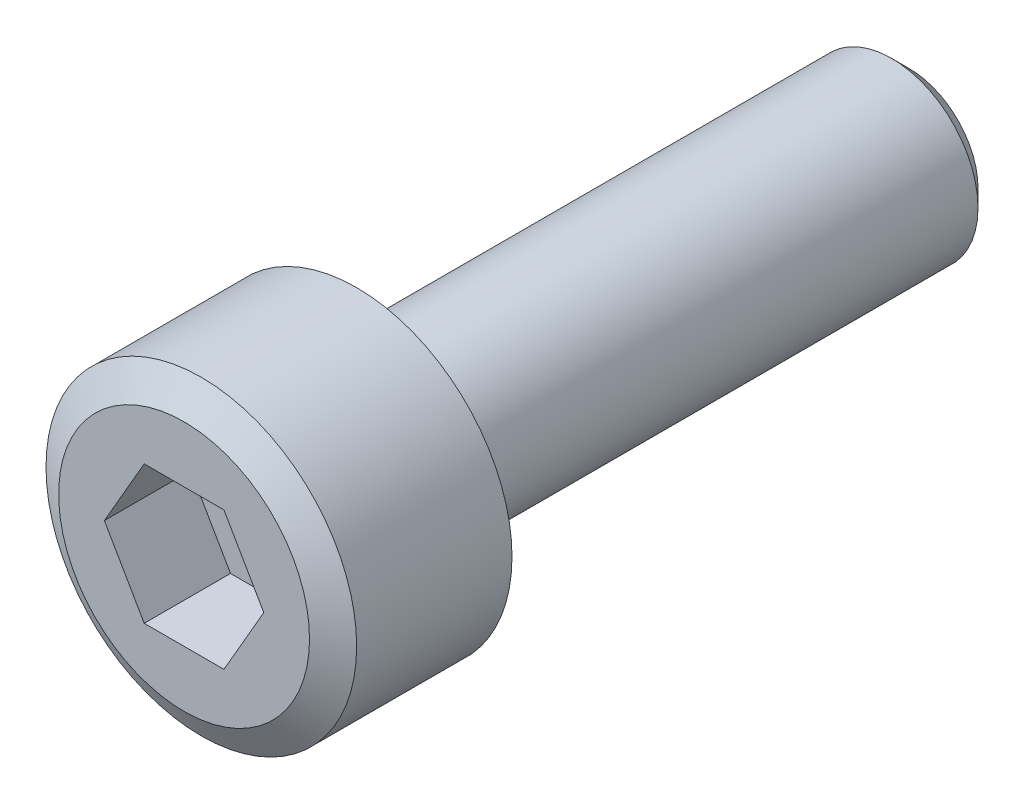
ISO-10303-21;
HEADER;
FILE_DESCRIPTION(('STEP AP214'),'2;1');
FILE_NAME('part.step','',(''),(''),'','','');
FILE_SCHEMA(('AUTOMOTIVE_DESIGN { 1 0 10303 214 1 1 1 1 }'));
ENDSEC;
DATA;
#1=APPLICATION_CONTEXT('core data for automotive mechanical design processes');
#2=APPLICATION_PROTOCOL_DEFINITION('international standard','automotive_design',2000,#1);
#3=PRODUCT_CONTEXT('',#1,'mechanical');
#4=PRODUCT('Part','Part','',(#3));
#5=PRODUCT_RELATED_PRODUCT_CATEGORY('part','',(#4));
#6=PRODUCT_DEFINITION_FORMATION('','',#4);
#7=PRODUCT_DEFINITION_CONTEXT('part definition',#1,'design');
#8=PRODUCT_DEFINITION('design','',#6,#7);
#9=PRODUCT_DEFINITION_SHAPE('','',#8);
#10=(LENGTH_UNIT() NAMED_UNIT(*) SI_UNIT(.MILLI.,.METRE.));
#11=(NAMED_UNIT(*) PLANE_ANGLE_UNIT() SI_UNIT($,.RADIAN.));
#12=(NAMED_UNIT(*) SI_UNIT($,.STERADIAN.) SOLID_ANGLE_UNIT());
#13=UNCERTAINTY_MEASURE_WITH_UNIT(LENGTH_MEASURE(1.E-05),#10,'distance_accuracy_value','');
#14=(GEOMETRIC_REPRESENTATION_CONTEXT(3) GLOBAL_UNCERTAINTY_ASSIGNED_CONTEXT((#13)) GLOBAL_UNIT_ASSIGNED_CONTEXT((#10,
#11,#12)) REPRESENTATION_CONTEXT('',''));
#15=CARTESIAN_POINT('',(0.,0.,0.));
#16=DIRECTION('',(0.,0.,1.));
#17=DIRECTION('',(1.,0.,0.));
#18=AXIS2_PLACEMENT_3D('',#15,#16,#17);
#19=CARTESIAN_POINT('',(0.,1.81698729810778,2.5));
#20=DIRECTION('',(0.,0.,-1.));
#21=DIRECTION('',(-1.,0.,0.));
#22=AXIS2_PLACEMENT_3D('',#19,#20,#21);
#23=PLANE('',#22);
#24=DIRECTION('',(-0.5,0.866025403784439,0.));
#25=VECTOR('',#24,1.);
#26=CARTESIAN_POINT('',(1.15470053837925,0.,2.5));
#27=LINE('',#26,#25);
#28=CARTESIAN_POINT('',(1.15470053837925,0.,2.5));
#29=VERTEX_POINT('',#28);
#30=CARTESIAN_POINT('',(0.577350269189626,1.,2.5));
#31=VERTEX_POINT('',#30);
#32=EDGE_CURVE('E121',#29,#31,#27,.T.);
#33=ORIENTED_EDGE('',*,*,#32,.F.);
#34=DIRECTION('',(0.5,0.866025403784439,0.));
#35=VECTOR('',#34,1.);
#36=CARTESIAN_POINT('',(0.577350269189626,-1.,2.5));
#37=LINE('',#36,#35);
#38=CARTESIAN_POINT('',(0.577350269189626,-1.,2.5));
#39=VERTEX_POINT('',#38);
#40=EDGE_CURVE('E47',#39,#29,#37,.T.);
#41=ORIENTED_EDGE('',*,*,#40,.F.);
#42=DIRECTION('',(1.,0.,0.));
#43=VECTOR('',#42,1.);
#44=CARTESIAN_POINT('',(-0.577350269189626,-1.,2.5));
#45=LINE('',#44,#43);
#46=CARTESIAN_POINT('',(-0.577350269189626,-1.,2.5));
#47=VERTEX_POINT('',#46);
#48=EDGE_CURVE('E130',#47,#39,#45,.T.);
#49=ORIENTED_EDGE('',*,*,#48,.F.);
#50=DIRECTION('',(0.5,-0.866025403784439,0.));
#51=VECTOR('',#50,1.);
#52=CARTESIAN_POINT('',(-1.15470053837925,0.,2.5));
#53=LINE('',#52,#51);
#54=CARTESIAN_POINT('',(-1.15470053837925,0.,2.5));
#55=VERTEX_POINT('',#54);
#56=EDGE_CURVE('E128',#55,#47,#53,.T.);
#57=ORIENTED_EDGE('',*,*,#56,.F.);
#58=DIRECTION('',(-0.5,-0.866025403784439,0.));
#59=VECTOR('',#58,1.);
#60=CARTESIAN_POINT('',(-0.577350269189626,1.,2.5));
#61=LINE('',#60,#59);
#62=CARTESIAN_POINT('',(-0.577350269189626,1.,2.5));
#63=VERTEX_POINT('',#62);
#64=EDGE_CURVE('E95',#63,#55,#61,.T.);
#65=ORIENTED_EDGE('',*,*,#64,.F.);
#66=DIRECTION('',(-1.,0.,0.));
#67=VECTOR('',#66,1.);
#68=CARTESIAN_POINT('',(0.577350269189626,1.,2.5));
#69=LINE('',#68,#67);
#70=EDGE_CURVE('E124',#31,#63,#69,.T.);
#71=ORIENTED_EDGE('',*,*,#70,.F.);
#72=EDGE_LOOP('',(#33,#41,#49,#57,#65,#71));
#73=FACE_BOUND('',#72,.T.);
#74=CARTESIAN_POINT('',(0.,0.,2.5));
#75=DIRECTION('',(0.,0.,1.));
#76=DIRECTION('',(1.,0.,0.));
#77=AXIS2_PLACEMENT_3D('',#74,#75,#76);
#78=CIRCLE('',#77,1.81698729810778);
#79=CARTESIAN_POINT('',(1.81698729810778,0.,2.5));
#80=VERTEX_POINT('',#79);
#81=EDGE_CURVE('E11',#80,#80,#78,.T.);
#82=ORIENTED_EDGE('',*,*,#81,.T.);
#83=EDGE_LOOP('',(#82));
#84=FACE_BOUND('',#83,.T.);
#85=ADVANCED_FACE('F33',(#73,#84),#23,.F.);
#86=CARTESIAN_POINT('',(0.,0.,2.25));
#87=DIRECTION('',(0.,0.,-1.));
#88=DIRECTION('',(-1.,0.,0.));
#89=AXIS2_PLACEMENT_3D('',#86,#87,#88);
#90=CONICAL_SURFACE('',#89,2.25,1.0471975511966);
#91=ORIENTED_EDGE('',*,*,#81,.F.);
#92=EDGE_LOOP('',(#91));
#93=FACE_BOUND('',#92,.T.);
#94=CARTESIAN_POINT('',(0.,0.,2.25));
#95=DIRECTION('',(0.,0.,1.));
#96=DIRECTION('',(1.,0.,0.));
#97=AXIS2_PLACEMENT_3D('',#94,#95,#96);
#98=CIRCLE('',#97,2.25);
#99=CARTESIAN_POINT('',(2.25,0.,2.25));
#100=VERTEX_POINT('',#99);
#101=EDGE_CURVE('E40',#100,#100,#98,.T.);
#102=ORIENTED_EDGE('',*,*,#101,.T.);
#103=EDGE_LOOP('',(#102));
#104=FACE_BOUND('',#103,.T.);
#105=ADVANCED_FACE('F156',(#93,#104),#90,.T.);
#106=CARTESIAN_POINT('',(0.,0.,0.));
#107=DIRECTION('',(0.,0.,1.));
#108=DIRECTION('',(1.,0.,0.));
#109=AXIS2_PLACEMENT_3D('',#106,#107,#108);
#110=CYLINDRICAL_SURFACE('',#109,2.25);
#111=ORIENTED_EDGE('',*,*,#101,.F.);
#112=EDGE_LOOP('',(#111));
#113=FACE_BOUND('',#112,.T.);
#114=CARTESIAN_POINT('',(0.,0.,0.));
#115=DIRECTION('',(0.,0.,1.));
#116=DIRECTION('',(1.,0.,0.));
#117=AXIS2_PLACEMENT_3D('',#114,#115,#116);
#118=CIRCLE('',#117,2.25);
#119=CARTESIAN_POINT('',(2.25,0.,0.));
#120=VERTEX_POINT('',#119);
#121=EDGE_CURVE('E151',#120,#120,#118,.T.);
#122=ORIENTED_EDGE('',*,*,#121,.T.);
#123=EDGE_LOOP('',(#122));
#124=FACE_BOUND('',#123,.T.);
#125=ADVANCED_FACE('F158',(#113,#124),#110,.T.);
#126=CARTESIAN_POINT('',(0.,1.35,0.));
#127=DIRECTION('',(0.,0.,1.));
#128=DIRECTION('',(1.,0.,0.));
#129=AXIS2_PLACEMENT_3D('',#126,#127,#128);
#130=PLANE('',#129);
#131=ORIENTED_EDGE('',*,*,#121,.F.);
#132=EDGE_LOOP('',(#131));
#133=FACE_BOUND('',#132,.T.);
#134=CARTESIAN_POINT('',(0.,0.,0.));
#135=DIRECTION('',(0.,0.,1.));
#136=DIRECTION('',(1.,0.,0.));
#137=AXIS2_PLACEMENT_3D('',#134,#135,#136);
#138=CIRCLE('',#137,1.35);
#139=CARTESIAN_POINT('',(1.35,0.,0.));
#140=VERTEX_POINT('',#139);
#141=EDGE_CURVE('E148',#140,#140,#138,.T.);
#142=ORIENTED_EDGE('',*,*,#141,.T.);
#143=EDGE_LOOP('',(#142));
#144=FACE_BOUND('',#143,.T.);
#145=ADVANCED_FACE('F161',(#133,#144),#130,.F.);
#146=CARTESIAN_POINT('',(0.,0.,-0.1));
#147=DIRECTION('',(0.,0.,1.));
#148=DIRECTION('',(1.,0.,0.));
#149=AXIS2_PLACEMENT_3D('',#146,#147,#148);
#150=TOROIDAL_SURFACE('',#149,1.35,0.0999999999999999);
#151=ORIENTED_EDGE('',*,*,#141,.F.);
#152=EDGE_LOOP('',(#151));
#153=FACE_BOUND('',#152,.T.);
#154=CARTESIAN_POINT('',(0.,0.,-0.1));
#155=DIRECTION('',(0.,0.,1.));
#156=DIRECTION('',(1.,0.,0.));
#157=AXIS2_PLACEMENT_3D('',#154,#155,#156);
#158=CIRCLE('',#157,1.25);
#159=CARTESIAN_POINT('',(1.25,0.,-0.1));
#160=VERTEX_POINT('',#159);
#161=EDGE_CURVE('E145',#160,#160,#158,.T.);
#162=ORIENTED_EDGE('',*,*,#161,.T.);
#163=EDGE_LOOP('',(#162));
#164=FACE_BOUND('',#163,.T.);
#165=ADVANCED_FACE('F167',(#153,#164),#150,.F.);
#166=CARTESIAN_POINT('',(0.,0.,0.));
#167=DIRECTION('',(0.,0.,1.));
#168=DIRECTION('',(1.,0.,0.));
#169=AXIS2_PLACEMENT_3D('',#166,#167,#168);
#170=CYLINDRICAL_SURFACE('',#169,1.25);
#171=ORIENTED_EDGE('',*,*,#161,.F.);
#172=EDGE_LOOP('',(#171));
#173=FACE_BOUND('',#172,.T.);
#174=CARTESIAN_POINT('',(0.,0.,-7.75));
#175=DIRECTION('',(0.,0.,1.));
#176=DIRECTION('',(1.,0.,0.));
#177=AXIS2_PLACEMENT_3D('',#174,#175,#176);
#178=CIRCLE('',#177,1.25);
#179=CARTESIAN_POINT('',(1.25,0.,-7.75));
#180=VERTEX_POINT('',#179);
#181=EDGE_CURVE('E142',#180,#180,#178,.T.);
#182=ORIENTED_EDGE('',*,*,#181,.T.);
#183=EDGE_LOOP('',(#182));
#184=FACE_BOUND('',#183,.T.);
#185=ADVANCED_FACE('F173',(#173,#184),#170,.T.);
#186=CARTESIAN_POINT('',(0.,0.,-8.));
#187=DIRECTION('',(0.,0.,1.));
#188=DIRECTION('',(1.,0.,0.));
#189=AXIS2_PLACEMENT_3D('',#186,#187,#188);
#190=CONICAL_SURFACE('',#189,1.,0.785398163397442);
#191=ORIENTED_EDGE('',*,*,#181,.F.);
#192=EDGE_LOOP('',(#191));
#193=FACE_BOUND('',#192,.T.);
#194=CARTESIAN_POINT('',(0.,0.,-8.));
#195=DIRECTION('',(0.,0.,1.));
#196=DIRECTION('',(1.,0.,0.));
#197=AXIS2_PLACEMENT_3D('',#194,#195,#196);
#198=CIRCLE('',#197,1.);
#199=CARTESIAN_POINT('',(1.,0.,-8.));
#200=VERTEX_POINT('',#199);
#201=EDGE_CURVE('E134',#200,#200,#198,.T.);
#202=ORIENTED_EDGE('',*,*,#201,.T.);
#203=EDGE_LOOP('',(#202));
#204=FACE_BOUND('',#203,.T.);
#205=ADVANCED_FACE('F179',(#193,#204),#190,.T.);
#206=CARTESIAN_POINT('',(0.,0.,-8.));
#207=DIRECTION('',(0.,0.,1.));
#208=DIRECTION('',(1.,0.,0.));
#209=AXIS2_PLACEMENT_3D('',#206,#207,#208);
#210=PLANE('',#209);
#211=ORIENTED_EDGE('',*,*,#201,.F.);
#212=EDGE_LOOP('',(#211));
#213=FACE_BOUND('',#212,.T.);
#214=ADVANCED_FACE('F185',(#213),#210,.F.);
#215=CARTESIAN_POINT('',(0.577350269189626,-1.,1.25));
#216=DIRECTION('',(0.866025403784439,-0.5,0.));
#217=DIRECTION('',(0.5,0.866025403784439,0.));
#218=AXIS2_PLACEMENT_3D('',#215,#216,#217);
#219=PLANE('',#218);
#220=ORIENTED_EDGE('',*,*,#40,.T.);
#221=DIRECTION('',(0.,0.,1.));
#222=VECTOR('',#221,1.);
#223=CARTESIAN_POINT('',(1.15470053837925,0.,1.25));
#224=LINE('',#223,#222);
#225=CARTESIAN_POINT('',(1.15470053837925,0.,1.25));
#226=VERTEX_POINT('',#225);
#227=EDGE_CURVE('E77',#226,#29,#224,.T.);
#228=ORIENTED_EDGE('',*,*,#227,.F.);
#229=DIRECTION('',(0.5,0.866025403784439,0.));
#230=VECTOR('',#229,1.);
#231=CARTESIAN_POINT('',(0.577350269189626,-1.,1.25));
#232=LINE('',#231,#230);
#233=CARTESIAN_POINT('',(0.577350269189626,-1.,1.25));
#234=VERTEX_POINT('',#233);
#235=EDGE_CURVE('E132',#234,#226,#232,.T.);
#236=ORIENTED_EDGE('',*,*,#235,.F.);
#237=DIRECTION('',(0.,0.,1.));
#238=VECTOR('',#237,1.);
#239=CARTESIAN_POINT('',(0.577350269189626,-1.,1.25));
#240=LINE('',#239,#238);
#241=EDGE_CURVE('E55',#234,#39,#240,.T.);
#242=ORIENTED_EDGE('',*,*,#241,.T.);
#243=EDGE_LOOP('',(#220,#228,#236,#242));
#244=FACE_BOUND('',#243,.T.);
#245=ADVANCED_FACE('F190',(#244),#219,.F.);
#246=CARTESIAN_POINT('',(-0.577350269189626,-1.,1.25));
#247=DIRECTION('',(0.,-1.,0.));
#248=DIRECTION('',(1.,0.,0.));
#249=AXIS2_PLACEMENT_3D('',#246,#247,#248);
#250=PLANE('',#249);
#251=ORIENTED_EDGE('',*,*,#48,.T.);
#252=ORIENTED_EDGE('',*,*,#241,.F.);
#253=DIRECTION('',(1.,0.,0.));
#254=VECTOR('',#253,1.);
#255=CARTESIAN_POINT('',(-0.577350269189626,-1.,1.25));
#256=LINE('',#255,#254);
#257=CARTESIAN_POINT('',(-0.577350269189626,-1.,1.25));
#258=VERTEX_POINT('',#257);
#259=EDGE_CURVE('E107',#258,#234,#256,.T.);
#260=ORIENTED_EDGE('',*,*,#259,.F.);
#261=DIRECTION('',(0.,0.,1.));
#262=VECTOR('',#261,1.);
#263=CARTESIAN_POINT('',(-0.577350269189626,-1.,1.25));
#264=LINE('',#263,#262);
#265=EDGE_CURVE('E99',#258,#47,#264,.T.);
#266=ORIENTED_EDGE('',*,*,#265,.T.);
#267=EDGE_LOOP('',(#251,#252,#260,#266));
#268=FACE_BOUND('',#267,.T.);
#269=ADVANCED_FACE('F195',(#268),#250,.F.);
#270=CARTESIAN_POINT('',(-1.15470053837925,0.,1.25));
#271=DIRECTION('',(-0.866025403784439,-0.5,0.));
#272=DIRECTION('',(0.5,-0.866025403784439,0.));
#273=AXIS2_PLACEMENT_3D('',#270,#271,#272);
#274=PLANE('',#273);
#275=ORIENTED_EDGE('',*,*,#56,.T.);
#276=ORIENTED_EDGE('',*,*,#265,.F.);
#277=DIRECTION('',(0.5,-0.866025403784439,0.));
#278=VECTOR('',#277,1.);
#279=CARTESIAN_POINT('',(-1.15470053837925,0.,1.25));
#280=LINE('',#279,#278);
#281=CARTESIAN_POINT('',(-1.15470053837925,0.,1.25));
#282=VERTEX_POINT('',#281);
#283=EDGE_CURVE('E103',#282,#258,#280,.T.);
#284=ORIENTED_EDGE('',*,*,#283,.F.);
#285=DIRECTION('',(0.,0.,1.));
#286=VECTOR('',#285,1.);
#287=CARTESIAN_POINT('',(-1.15470053837925,0.,1.25));
#288=LINE('',#287,#286);
#289=EDGE_CURVE('E88',#282,#55,#288,.T.);
#290=ORIENTED_EDGE('',*,*,#289,.T.);
#291=EDGE_LOOP('',(#275,#276,#284,#290));
#292=FACE_BOUND('',#291,.T.);
#293=ADVANCED_FACE('F104',(#292),#274,.F.);
#294=CARTESIAN_POINT('',(-0.577350269189626,1.,1.25));
#295=DIRECTION('',(-0.866025403784439,0.5,0.));
#296=DIRECTION('',(-0.5,-0.866025403784439,0.));
#297=AXIS2_PLACEMENT_3D('',#294,#295,#296);
#298=PLANE('',#297);
#299=ORIENTED_EDGE('',*,*,#64,.T.);
#300=ORIENTED_EDGE('',*,*,#289,.F.);
#301=DIRECTION('',(-0.5,-0.866025403784439,0.));
#302=VECTOR('',#301,1.);
#303=CARTESIAN_POINT('',(-0.577350269189626,1.,1.25));
#304=LINE('',#303,#302);
#305=CARTESIAN_POINT('',(-0.577350269189626,1.,1.25));
#306=VERTEX_POINT('',#305);
#307=EDGE_CURVE('E92',#306,#282,#304,.T.);
#308=ORIENTED_EDGE('',*,*,#307,.F.);
#309=DIRECTION('',(0.,0.,1.));
#310=VECTOR('',#309,1.);
#311=CARTESIAN_POINT('',(-0.577350269189626,1.,1.25));
#312=LINE('',#311,#310);
#313=EDGE_CURVE('E100',#306,#63,#312,.T.);
#314=ORIENTED_EDGE('',*,*,#313,.T.);
#315=EDGE_LOOP('',(#299,#300,#308,#314));
#316=FACE_BOUND('',#315,.T.);
#317=ADVANCED_FACE('F90',(#316),#298,.F.);
#318=CARTESIAN_POINT('',(0.577350269189626,1.,1.25));
#319=DIRECTION('',(0.,1.,0.));
#320=DIRECTION('',(-1.,0.,0.));
#321=AXIS2_PLACEMENT_3D('',#318,#319,#320);
#322=PLANE('',#321);
#323=ORIENTED_EDGE('',*,*,#70,.T.);
#324=ORIENTED_EDGE('',*,*,#313,.F.);
#325=DIRECTION('',(-1.,0.,0.));
#326=VECTOR('',#325,1.);
#327=CARTESIAN_POINT('',(0.577350269189626,1.,1.25));
#328=LINE('',#327,#326);
#329=CARTESIAN_POINT('',(0.577350269189626,1.,1.25));
#330=VERTEX_POINT('',#329);
#331=EDGE_CURVE('E113',#330,#306,#328,.T.);
#332=ORIENTED_EDGE('',*,*,#331,.F.);
#333=DIRECTION('',(0.,0.,1.));
#334=VECTOR('',#333,1.);
#335=CARTESIAN_POINT('',(0.577350269189626,1.,1.25));
#336=LINE('',#335,#334);
#337=EDGE_CURVE('E137',#330,#31,#336,.T.);
#338=ORIENTED_EDGE('',*,*,#337,.T.);
#339=EDGE_LOOP('',(#323,#324,#332,#338));
#340=FACE_BOUND('',#339,.T.);
#341=ADVANCED_FACE('F221',(#340),#322,.F.);
#342=CARTESIAN_POINT('',(1.15470053837925,0.,1.25));
#343=DIRECTION('',(0.866025403784439,0.5,0.));
#344=DIRECTION('',(-0.5,0.866025403784439,0.));
#345=AXIS2_PLACEMENT_3D('',#342,#343,#344);
#346=PLANE('',#345);
#347=ORIENTED_EDGE('',*,*,#32,.T.);
#348=ORIENTED_EDGE('',*,*,#337,.F.);
#349=DIRECTION('',(-0.5,0.866025403784439,0.));
#350=VECTOR('',#349,1.);
#351=CARTESIAN_POINT('',(1.15470053837925,0.,1.25));
#352=LINE('',#351,#350);
#353=EDGE_CURVE('E115',#226,#330,#352,.T.);
#354=ORIENTED_EDGE('',*,*,#353,.F.);
#355=ORIENTED_EDGE('',*,*,#227,.T.);
#356=EDGE_LOOP('',(#347,#348,#354,#355));
#357=FACE_BOUND('',#356,.T.);
#358=ADVANCED_FACE('F209',(#357),#346,.F.);
#359=CARTESIAN_POINT('',(1.15470053837925,0.,1.25));
#360=DIRECTION('',(0.,0.,1.));
#361=DIRECTION('',(1.,0.,0.));
#362=AXIS2_PLACEMENT_3D('',#359,#360,#361);
#363=PLANE('',#362);
#364=ORIENTED_EDGE('',*,*,#235,.T.);
#365=ORIENTED_EDGE('',*,*,#353,.T.);
#366=ORIENTED_EDGE('',*,*,#331,.T.);
#367=ORIENTED_EDGE('',*,*,#307,.T.);
#368=ORIENTED_EDGE('',*,*,#283,.T.);
#369=ORIENTED_EDGE('',*,*,#259,.T.);
#370=EDGE_LOOP('',(#364,#365,#366,#367,#368,#369));
#371=FACE_BOUND('',#370,.T.);
#372=ADVANCED_FACE('F110',(#371),#363,.T.);
#373=CLOSED_SHELL('',(#85,#105,#125,#145,#165,#185,#205,#214,#245,#269,#293,#317,#341,#358,#372));
#374=MANIFOLD_SOLID_BREP('B2',#373);
#375=ADVANCED_BREP_SHAPE_REPRESENTATION('',(#18,#374),#14);
#376=SHAPE_DEFINITION_REPRESENTATION(#9,#375);
ENDSEC;
END-ISO-10303-21;
